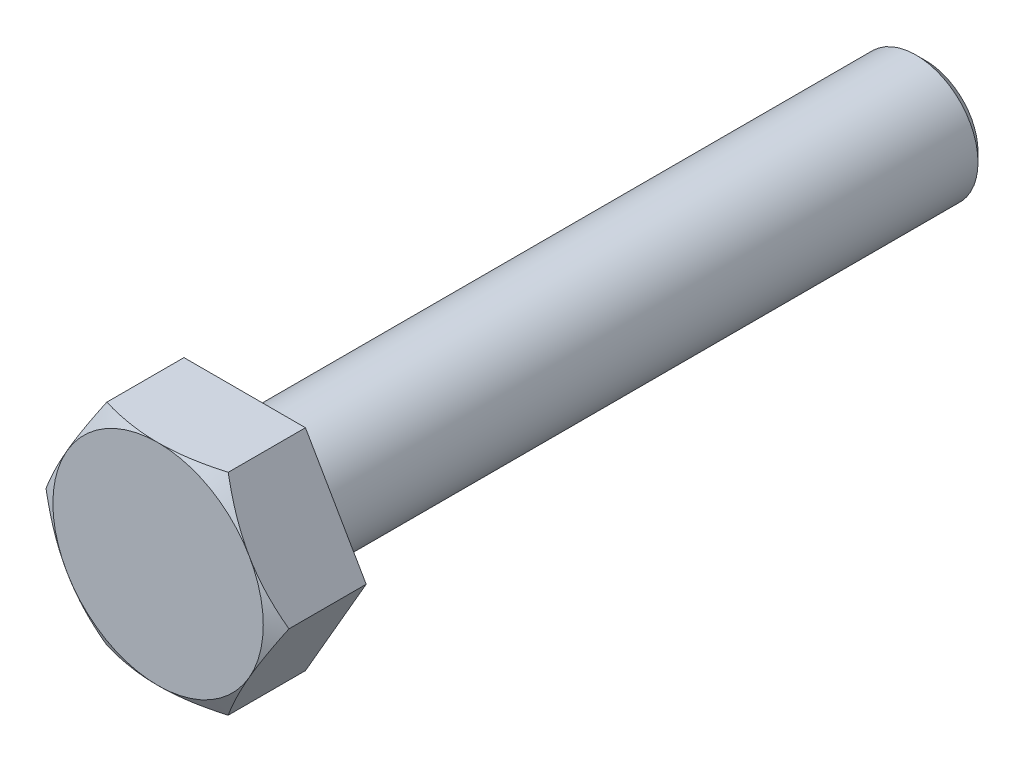
ISO-10303-21;
HEADER;
FILE_DESCRIPTION(('STEP AP214'),'2;1');
FILE_NAME('part.step','',(''),(''),'','','');
FILE_SCHEMA(('AUTOMOTIVE_DESIGN { 1 0 10303 214 1 1 1 1 }'));
ENDSEC;
DATA;
#1=APPLICATION_CONTEXT('core data for automotive mechanical design processes');
#2=APPLICATION_PROTOCOL_DEFINITION('international standard','automotive_design',2000,#1);
#3=PRODUCT_CONTEXT('',#1,'mechanical');
#4=PRODUCT('Part','Part','',(#3));
#5=PRODUCT_RELATED_PRODUCT_CATEGORY('part','',(#4));
#6=PRODUCT_DEFINITION_FORMATION('','',#4);
#7=PRODUCT_DEFINITION_CONTEXT('part definition',#1,'design');
#8=PRODUCT_DEFINITION('design','',#6,#7);
#9=PRODUCT_DEFINITION_SHAPE('','',#8);
#10=(LENGTH_UNIT() NAMED_UNIT(*) SI_UNIT(.MILLI.,.METRE.));
#11=(NAMED_UNIT(*) PLANE_ANGLE_UNIT() SI_UNIT($,.RADIAN.));
#12=(NAMED_UNIT(*) SI_UNIT($,.STERADIAN.) SOLID_ANGLE_UNIT());
#13=UNCERTAINTY_MEASURE_WITH_UNIT(LENGTH_MEASURE(1.E-05),#10,'distance_accuracy_value','');
#14=(GEOMETRIC_REPRESENTATION_CONTEXT(3) GLOBAL_UNCERTAINTY_ASSIGNED_CONTEXT((#13)) GLOBAL_UNIT_ASSIGNED_CONTEXT((#10,
#11,#12)) REPRESENTATION_CONTEXT('',''));
#15=CARTESIAN_POINT('',(0.,0.,0.));
#16=DIRECTION('',(0.,0.,1.));
#17=DIRECTION('',(1.,0.,0.));
#18=AXIS2_PLACEMENT_3D('',#15,#16,#17);
#19=CARTESIAN_POINT('',(9.81495457622364,0.,0.));
#20=DIRECTION('',(0.,0.,1.));
#21=DIRECTION('',(1.,0.,0.));
#22=AXIS2_PLACEMENT_3D('',#19,#20,#21);
#23=PLANE('',#22);
#24=DIRECTION('',(0.5,0.866025403784439,0.));
#25=VECTOR('',#24,1.);
#26=CARTESIAN_POINT('',(4.90747728811182,-8.50000000000001,0.));
#27=LINE('',#26,#25);
#28=CARTESIAN_POINT('',(4.90747728811182,-8.50000000000001,0.));
#29=VERTEX_POINT('',#28);
#30=CARTESIAN_POINT('',(9.81495457622364,0.,0.));
#31=VERTEX_POINT('',#30);
#32=EDGE_CURVE('E200',#29,#31,#27,.T.);
#33=ORIENTED_EDGE('',*,*,#32,.F.);
#34=DIRECTION('',(1.,0.,0.));
#35=VECTOR('',#34,1.);
#36=CARTESIAN_POINT('',(-4.9074772881118,-8.50000000000001,0.));
#37=LINE('',#36,#35);
#38=CARTESIAN_POINT('',(-4.9074772881118,-8.50000000000001,0.));
#39=VERTEX_POINT('',#38);
#40=EDGE_CURVE('E214',#39,#29,#37,.T.);
#41=ORIENTED_EDGE('',*,*,#40,.F.);
#42=DIRECTION('',(0.5,-0.866025403784438,0.));
#43=VECTOR('',#42,1.);
#44=CARTESIAN_POINT('',(-9.81495457622363,0.,0.));
#45=LINE('',#44,#43);
#46=CARTESIAN_POINT('',(-9.81495457622363,0.,0.));
#47=VERTEX_POINT('',#46);
#48=EDGE_CURVE('E211',#47,#39,#45,.T.);
#49=ORIENTED_EDGE('',*,*,#48,.F.);
#50=DIRECTION('',(-0.499999999999999,-0.866025403784439,0.));
#51=VECTOR('',#50,1.);
#52=CARTESIAN_POINT('',(-4.90747728811181,8.5,0.));
#53=LINE('',#52,#51);
#54=CARTESIAN_POINT('',(-4.90747728811181,8.5,0.));
#55=VERTEX_POINT('',#54);
#56=EDGE_CURVE('E208',#55,#47,#53,.T.);
#57=ORIENTED_EDGE('',*,*,#56,.F.);
#58=DIRECTION('',(-1.,0.,0.));
#59=VECTOR('',#58,1.);
#60=CARTESIAN_POINT('',(4.90747728811182,8.5,0.));
#61=LINE('',#60,#59);
#62=CARTESIAN_POINT('',(4.90747728811182,8.5,0.));
#63=VERTEX_POINT('',#62);
#64=EDGE_CURVE('E206',#63,#55,#61,.T.);
#65=ORIENTED_EDGE('',*,*,#64,.F.);
#66=DIRECTION('',(-0.5,0.866025403784439,0.));
#67=VECTOR('',#66,1.);
#68=CARTESIAN_POINT('',(9.81495457622364,0.,0.));
#69=LINE('',#68,#67);
#70=EDGE_CURVE('E203',#31,#63,#69,.T.);
#71=ORIENTED_EDGE('',*,*,#70,.F.);
#72=EDGE_LOOP('',(#33,#41,#49,#57,#65,#71));
#73=FACE_BOUND('',#72,.T.);
#74=CARTESIAN_POINT('',(0.,0.,0.));
#75=DIRECTION('',(0.,0.,1.));
#76=DIRECTION('',(1.,0.,0.));
#77=AXIS2_PLACEMENT_3D('',#74,#75,#76);
#78=CIRCLE('',#77,5.);
#79=CARTESIAN_POINT('',(5.,0.,0.));
#80=VERTEX_POINT('',#79);
#81=EDGE_CURVE('E141',#80,#80,#78,.F.);
#82=ORIENTED_EDGE('',*,*,#81,.F.);
#83=EDGE_LOOP('',(#82));
#84=FACE_BOUND('',#83,.T.);
#85=ADVANCED_FACE('F52',(#73,#84),#23,.F.);
#86=CARTESIAN_POINT('',(4.90747728811182,-8.50000000000001,7.));
#87=DIRECTION('',(-0.866025403784439,0.5,0.));
#88=DIRECTION('',(-0.5,-0.866025403784439,0.));
#89=AXIS2_PLACEMENT_3D('',#86,#87,#88);
#90=PLANE('',#89);
#91=CARTESIAN_POINT('',(4.90736181805798,-8.50020000000001,6.24074395360204));
#92=CARTESIAN_POINT('',(5.01523349642112,-8.31336077237732,6.30301386075109));
#93=CARTESIAN_POINT('',(5.1235073585344,-8.12582494206541,6.36245770425267));
#94=CARTESIAN_POINT('',(5.34093440801325,-7.74923024542824,6.47491488923975));
#95=CARTESIAN_POINT('',(5.45008795342048,-7.56017075895664,6.52792545501692));
#96=CARTESIAN_POINT('',(5.77929626245293,-6.98996524143861,6.67626661026955));
#97=CARTESIAN_POINT('',(6.00065055601907,-6.60656835850854,6.76064107206222));
#98=CARTESIAN_POINT('',(6.33190297706554,-6.03282233512585,6.85957998430525));
#99=CARTESIAN_POINT('',(6.44081150248911,-5.84418723571482,6.88776480055181));
#100=CARTESIAN_POINT('',(6.65912106673028,-5.4660639786709,6.93502591523381));
#101=CARTESIAN_POINT('',(6.76852206116958,-5.27657589790346,6.95410301844705));
#102=CARTESIAN_POINT('',(6.98751241863724,-4.8972734724018,6.9826652273342));
#103=CARTESIAN_POINT('',(7.09710142587342,-4.70745974391771,6.99216121852868));
#104=CARTESIAN_POINT('',(7.31638067381389,-4.32765694543932,7.00135762036095));
#105=CARTESIAN_POINT('',(7.42607091128588,-4.13766788104354,7.00105833363274));
#106=CARTESIAN_POINT('',(7.63114046852538,-3.78247698881906,6.9913455244265));
#107=CARTESIAN_POINT('',(7.72653426027262,-3.61725009478621,6.98311683140245));
#108=CARTESIAN_POINT('',(7.91709842091259,-3.28718328645605,6.9594107589431));
#109=CARTESIAN_POINT('',(8.01226877430994,-3.12234339899756,6.94393289088121));
#110=CARTESIAN_POINT('',(8.29741139110886,-2.62846189929869,6.88699137914137));
#111=CARTESIAN_POINT('',(8.48687892877741,-2.30029449767179,6.8350269387224));
#112=CARTESIAN_POINT('',(8.86782383081656,-1.64047857245564,6.70511505947707));
#113=CARTESIAN_POINT('',(9.05925257719133,-1.30891425770532,6.62661693012797));
#114=CARTESIAN_POINT('',(9.43925537404324,-0.650730106539531,6.44845866002739));
#115=CARTESIAN_POINT('',(9.62783429074897,-0.324101841568914,6.34884036387004));
#116=CARTESIAN_POINT('',(9.81507004627747,0.000200000000009231,6.24074395360205));
#117=B_SPLINE_CURVE_WITH_KNOTS('',3,(#91,#92,#93,#94,#95,#96,#97,#98,#99,#100,#101,#102,#103,
#104,#105,#106,#107,#108,#109,#110,#111,#112,#113,#114,#115,#116),.UNSPECIFIED.,.F.,.F.,(4,2,2,
2,2,2,2,2,2,2,2,2,4),(0.,0.673596396411508,1.34748239783842,2.69805431639326,3.356799954547,
4.01548737369113,4.67342558367775,5.33134346608655,5.9040955679884,6.47688628148364,
7.62328361419565,8.79510569878587,9.96462743748731),.UNSPECIFIED.);
#118=CARTESIAN_POINT('',(4.90747728811182,-8.50000000000001,6.24081062144516));
#119=VERTEX_POINT('',#118);
#120=CARTESIAN_POINT('',(7.36121593216774,-4.24999999999999,7.));
#121=VERTEX_POINT('',#120);
#122=EDGE_CURVE('E198',#119,#121,#117,.T.);
#123=ORIENTED_EDGE('',*,*,#122,.F.);
#124=DIRECTION('',(0.,0.,-1.));
#125=VECTOR('',#124,1.);
#126=CARTESIAN_POINT('',(4.90747728811182,-8.50000000000001,7.));
#127=LINE('',#126,#125);
#128=EDGE_CURVE('E217',#119,#29,#127,.T.);
#129=ORIENTED_EDGE('',*,*,#128,.T.);
#130=ORIENTED_EDGE('',*,*,#32,.T.);
#131=DIRECTION('',(0.,0.,-1.));
#132=VECTOR('',#131,1.);
#133=CARTESIAN_POINT('',(9.81495457622364,0.,7.));
#134=LINE('',#133,#132);
#135=CARTESIAN_POINT('',(9.81495457622364,0.,6.24081062144517));
#136=VERTEX_POINT('',#135);
#137=EDGE_CURVE('E226',#136,#31,#134,.T.);
#138=ORIENTED_EDGE('',*,*,#137,.F.);
#139=EDGE_CURVE('E192',#121,#136,#117,.T.);
#140=ORIENTED_EDGE('',*,*,#139,.F.);
#141=EDGE_LOOP('',(#123,#129,#130,#138,#140));
#142=FACE_BOUND('',#141,.T.);
#143=ADVANCED_FACE('F187',(#142),#90,.F.);
#144=CARTESIAN_POINT('',(9.81495457622364,0.,7.));
#145=DIRECTION('',(-0.866025403784438,-0.5,0.));
#146=DIRECTION('',(0.5,-0.866025403784439,0.));
#147=AXIS2_PLACEMENT_3D('',#144,#145,#146);
#148=PLANE('',#147);
#149=CARTESIAN_POINT('',(9.81507004627747,-0.000199999999991347,6.24074395360205));
#150=CARTESIAN_POINT('',(9.70719836791433,0.1866392276227,6.30301386075109));
#151=CARTESIAN_POINT('',(9.59892450580105,0.374175057934605,6.36245770425268));
#152=CARTESIAN_POINT('',(9.3814974563222,0.75076975457177,6.47491488923976));
#153=CARTESIAN_POINT('',(9.27234391091497,0.939829241043374,6.52792545501693));
#154=CARTESIAN_POINT('',(8.94313560188252,1.5100347585614,6.67626661026956));
#155=CARTESIAN_POINT('',(8.72178130831639,1.89343164149147,6.76064107206223));
#156=CARTESIAN_POINT('',(8.39052888726991,2.46717766487417,6.85957998430526));
#157=CARTESIAN_POINT('',(8.28162036184634,2.65581276428519,6.88776480055181));
#158=CARTESIAN_POINT('',(8.06331079760518,3.03393602132912,6.93502591523381));
#159=CARTESIAN_POINT('',(7.95390980316587,3.22342410209655,6.95410301844705));
#160=CARTESIAN_POINT('',(7.73491944569821,3.60272652759821,6.98266522733421));
#161=CARTESIAN_POINT('',(7.62533043846204,3.7925402560823,6.99216121852868));
#162=CARTESIAN_POINT('',(7.40605119052156,4.17234305456069,7.00135762036096));
#163=CARTESIAN_POINT('',(7.29636095304957,4.36233211895647,7.00105833363275));
#164=CARTESIAN_POINT('',(7.09129139581007,4.71752301118095,6.9913455244265));
#165=CARTESIAN_POINT('',(6.99589760406283,4.8827499052138,6.98311683140245));
#166=CARTESIAN_POINT('',(6.80533344342286,5.21281671354395,6.9594107589431));
#167=CARTESIAN_POINT('',(6.71016309002551,5.37765660100244,6.94393289088121));
#168=CARTESIAN_POINT('',(6.42502047322659,5.87153810070131,6.88699137914137));
#169=CARTESIAN_POINT('',(6.23555293555804,6.19970550232821,6.8350269387224));
#170=CARTESIAN_POINT('',(5.8546080335189,6.85952142754436,6.70511505947707));
#171=CARTESIAN_POINT('',(5.66317928714412,7.19108574229468,6.62661693012798));
#172=CARTESIAN_POINT('',(5.28317649029221,7.84926989346047,6.44845866002739));
#173=CARTESIAN_POINT('',(5.09459757358649,8.17589815843108,6.34884036387004));
#174=CARTESIAN_POINT('',(4.90736181805798,8.5002,6.24074395360205));
#175=B_SPLINE_CURVE_WITH_KNOTS('',3,(#149,#150,#151,#152,#153,#154,#155,#156,#157,#158,#159,
#160,#161,#162,#163,#164,#165,#166,#167,#168,#169,#170,#171,#172,#173,#174),.UNSPECIFIED.,.F.,
.F.,(4,2,2,2,2,2,2,2,2,2,2,2,4),(0.,0.673596396411507,1.34748239783841,2.69805431639326,
3.35679995454699,4.01548737369113,4.67342558367775,5.33134346608655,5.90409556798839,
6.47688628148363,7.62328361419564,8.79510569878585,9.96462743748729),.UNSPECIFIED.);
#176=CARTESIAN_POINT('',(7.36121593216774,4.25000000000002,7.));
#177=VERTEX_POINT('',#176);
#178=EDGE_CURVE('E199',#136,#177,#175,.T.);
#179=ORIENTED_EDGE('',*,*,#178,.F.);
#180=ORIENTED_EDGE('',*,*,#137,.T.);
#181=ORIENTED_EDGE('',*,*,#70,.T.);
#182=DIRECTION('',(0.,0.,-1.));
#183=VECTOR('',#182,1.);
#184=CARTESIAN_POINT('',(4.90747728811182,8.5,7.));
#185=LINE('',#184,#183);
#186=CARTESIAN_POINT('',(4.90747728811182,8.5,6.24081062144517));
#187=VERTEX_POINT('',#186);
#188=EDGE_CURVE('E224',#187,#63,#185,.T.);
#189=ORIENTED_EDGE('',*,*,#188,.F.);
#190=EDGE_CURVE('E127',#177,#187,#175,.T.);
#191=ORIENTED_EDGE('',*,*,#190,.F.);
#192=EDGE_LOOP('',(#179,#180,#181,#189,#191));
#193=FACE_BOUND('',#192,.T.);
#194=ADVANCED_FACE('F182',(#193),#148,.F.);
#195=CARTESIAN_POINT('',(4.90747728811182,8.5,7.));
#196=DIRECTION('',(0.,-1.,0.));
#197=DIRECTION('',(1.,0.,0.));
#198=AXIS2_PLACEMENT_3D('',#195,#196,#197);
#199=PLANE('',#198);
#200=CARTESIAN_POINT('',(-13.3127722555906,8.5,2.78826852986932));
#201=CARTESIAN_POINT('',(-12.9404144406593,8.5,2.96941701431854));
#202=CARTESIAN_POINT('',(-12.567215792402,8.5,3.14886602911127));
#203=CARTESIAN_POINT('',(-11.8186901702636,8.5,3.50341189717156));
#204=CARTESIAN_POINT('',(-11.4433628836555,8.5,3.6785080894789));
#205=CARTESIAN_POINT('',(-10.6882613644858,8.5,4.02424829360525));
#206=CARTESIAN_POINT('',(-10.3084741208881,8.5,4.19486398516614));
#207=CARTESIAN_POINT('',(-9.54592452037174,8.5,4.52928604651138));
#208=CARTESIAN_POINT('',(-9.16316230121106,8.5,4.6930927293873));
#209=CARTESIAN_POINT('',(-8.38118642163861,8.5,5.01744068546287));
#210=CARTESIAN_POINT('',(-7.98185075741088,8.5,5.17768941082055));
#211=CARTESIAN_POINT('',(-7.1785568746563,8.5,5.4863721721723));
#212=CARTESIAN_POINT('',(-6.77459815015405,8.5,5.63480490053196));
#213=CARTESIAN_POINT('',(-5.96212545771606,8.5,5.91605400578927));
#214=CARTESIAN_POINT('',(-5.55362216781185,8.5,6.04890090403381));
#215=CARTESIAN_POINT('',(-4.73077113127289,8.5,6.29480344231656));
#216=CARTESIAN_POINT('',(-4.31642522789706,8.5,6.40786517973007));
#217=CARTESIAN_POINT('',(-3.48392241105069,8.5,6.60824046844821));
#218=CARTESIAN_POINT('',(-3.06580135614189,8.5,6.69569903377702));
#219=CARTESIAN_POINT('',(-2.43470958332224,8.5,6.80396887865594));
#220=CARTESIAN_POINT('',(-2.22367936823634,8.5,6.836240585499));
#221=CARTESIAN_POINT('',(-1.80052615623366,8.5,6.89251500239286));
#222=CARTESIAN_POINT('',(-1.58840326733942,8.5,6.91651851450317));
#223=CARTESIAN_POINT('',(-1.16617674125606,8.5,6.95547032072195));
#224=CARTESIAN_POINT('',(-0.956083894124211,8.5,6.97053508997365));
#225=CARTESIAN_POINT('',(-0.535448956339841,8.5,6.99176045016895));
#226=CARTESIAN_POINT('',(-0.324906873388335,8.5,6.99792119254076));
#227=CARTESIAN_POINT('',(0.0962490157034425,8.5,7.00119101168361));
#228=CARTESIAN_POINT('',(0.306862821747327,8.5,6.99830010057134));
#229=CARTESIAN_POINT('',(0.727778025528256,8.5,6.98353896935653));
#230=CARTESIAN_POINT('',(0.938079408017831,8.5,6.97166832455666));
#231=CARTESIAN_POINT('',(1.43959695159484,8.5,6.93290684508362));
#232=CARTESIAN_POINT('',(1.73050755044522,8.5,6.90197235135525));
#233=CARTESIAN_POINT('',(2.31024091921276,8.5,6.82457884662193));
#234=CARTESIAN_POINT('',(2.59906341485208,8.5,6.77811783270236));
#235=CARTESIAN_POINT('',(3.46202954887685,8.5,6.61790252618368));
#236=CARTESIAN_POINT('',(4.03236565990882,8.5,6.4833428350329));
#237=CARTESIAN_POINT('',(4.8853268846872,8.5,6.24909447510685));
#238=CARTESIAN_POINT('',(5.1723521357312,8.5,6.16449811272701));
#239=CARTESIAN_POINT('',(5.74361736454075,8.5,5.98628925318513));
#240=CARTESIAN_POINT('',(6.02785732321869,8.5,5.89267669428261));
#241=CARTESIAN_POINT('',(6.59363668173595,8.5,5.69795634941171));
#242=CARTESIAN_POINT('',(6.87517688252757,8.5,5.5968508693248));
#243=CARTESIAN_POINT('',(7.43590957248353,8.5,5.38835708016051));
#244=CARTESIAN_POINT('',(7.71510209449517,8.5,5.28096885915528));
#245=CARTESIAN_POINT('',(8.3937769231789,8.5,5.01254661879005));
#246=CARTESIAN_POINT('',(8.79214345747848,8.5,4.84869607279849));
#247=CARTESIAN_POINT('',(9.58530180729763,8.5,4.51253355712982));
#248=CARTESIAN_POINT('',(9.98009336208866,8.5,4.34022097609763));
#249=CARTESIAN_POINT('',(10.7667994687314,8.5,3.98889531541797));
#250=CARTESIAN_POINT('',(11.158713237833,8.5,3.80988048804884));
#251=CARTESIAN_POINT('',(11.9400608781415,8.5,3.44655799464724));
#252=CARTESIAN_POINT('',(12.3294948120185,8.5,3.26225046302525));
#253=CARTESIAN_POINT('',(13.1067885410169,8.5,2.88913981832012));
#254=CARTESIAN_POINT('',(13.4946458119203,8.5,2.70033145634226));
#255=CARTESIAN_POINT('',(14.2686448555246,8.5,2.31923087705477));
#256=CARTESIAN_POINT('',(14.6547866194464,8.5,2.12693864194171));
#257=CARTESIAN_POINT('',(15.4255695165389,8.5,1.73951703281517));
#258=CARTESIAN_POINT('',(15.8102108677963,8.5,1.54438809221331));
#259=CARTESIAN_POINT('',(16.5782744335987,8.5,1.15174407271826));
#260=CARTESIAN_POINT('',(16.961696643168,8.5,0.9542289841026));
#261=CARTESIAN_POINT('',(18.0423270244777,8.5,0.393993394329548));
#262=CARTESIAN_POINT('',(18.7383366520514,8.5,0.0289612323611447));
#263=CARTESIAN_POINT('',(20.1277877153105,8.5,-0.706016396451721));
#264=CARTESIAN_POINT('',(20.8212290431881,8.50000000000001,-1.07596206662414));
#265=CARTESIAN_POINT('',(22.2042055328319,8.50000000000001,-1.8185574653129));
#266=CARTESIAN_POINT('',(22.8937461922833,8.50000000000001,-2.19119696613751));
#267=CARTESIAN_POINT('',(24.2711951731736,8.50000000000001,-2.93938175625438));
#268=CARTESIAN_POINT('',(24.9591035921503,8.50000000000001,-3.31492686589471));
#269=CARTESIAN_POINT('',(25.6464179156733,8.50000000000001,-3.69154780861944));
#270=B_SPLINE_CURVE_WITH_KNOTS('',3,(#200,#201,#202,#203,#204,#205,#206,#207,#208,#209,#210,
#211,#212,#213,#214,#215,#216,#217,#218,#219,#220,#221,#222,#223,#224,#225,#226,#227,#228,#229,
#230,#231,#232,#233,#234,#235,#236,#237,#238,#239,#240,#241,#242,#243,#244,#245,#246,#247,#248,
#249,#250,#251,#252,#253,#254,#255,#256,#257,#258,#259,#260,#261,#262,#263,#264,#265,#266,#267,
#268,#269),.UNSPECIFIED.,.F.,.F.,(4,2,2,2,2,2,2,2,2,2,2,2,2,2,2,2,2,2,2,2,2,2,2,2,2,2,2,2,2,2,2,
2,2,2,4),(0.,1.24226493543645,2.48471736610549,3.73371640399653,4.98265794678726,
6.27337976098354,7.56424421677546,8.85253705017218,10.1404321566129,11.4208849829597,
12.0611991424598,12.7014511705268,13.3331660336055,13.9648701531666,14.59657342712,
15.2283065794053,16.1054657093355,16.9827380361343,18.7382005792614,19.6358195315064,
20.5334446308395,21.4307946318258,22.328132056673,23.6202378689622,24.912437169511,
26.2049758119965,27.4974816588931,28.7915767023275,30.0856783607683,31.3795843330998,
32.6734955792911,35.0312403285486,37.3890829505185,39.7404445819589,42.091661973883),.UNSPECIFIED.);
#271=CARTESIAN_POINT('',(0.,8.50000000000002,7.));
#272=VERTEX_POINT('',#271);
#273=EDGE_CURVE('E123',#187,#272,#270,.F.);
#274=ORIENTED_EDGE('',*,*,#273,.F.);
#275=ORIENTED_EDGE('',*,*,#188,.T.);
#276=ORIENTED_EDGE('',*,*,#64,.T.);
#277=DIRECTION('',(0.,0.,-1.));
#278=VECTOR('',#277,1.);
#279=CARTESIAN_POINT('',(-4.90747728811181,8.5,7.));
#280=LINE('',#279,#278);
#281=CARTESIAN_POINT('',(-4.90747728811181,8.5,6.24081062144518));
#282=VERTEX_POINT('',#281);
#283=EDGE_CURVE('E153',#282,#55,#280,.T.);
#284=ORIENTED_EDGE('',*,*,#283,.F.);
#285=EDGE_CURVE('E131',#272,#282,#270,.F.);
#286=ORIENTED_EDGE('',*,*,#285,.F.);
#287=EDGE_LOOP('',(#274,#275,#276,#284,#286));
#288=FACE_BOUND('',#287,.T.);
#289=ADVANCED_FACE('F151',(#288),#199,.F.);
#290=CARTESIAN_POINT('',(-4.90747728811181,8.5,7.));
#291=DIRECTION('',(0.866025403784439,-0.499999999999999,0.));
#292=DIRECTION('',(0.499999999999999,0.866025403784439,0.));
#293=AXIS2_PLACEMENT_3D('',#290,#291,#292);
#294=PLANE('',#293);
#295=CARTESIAN_POINT('',(-4.90736181805798,8.5002,6.24074395360205));
#296=CARTESIAN_POINT('',(-5.01523349642112,8.31336077237731,6.3030138607511));
#297=CARTESIAN_POINT('',(-5.1235073585344,8.1258249420654,6.36245770425268));
#298=CARTESIAN_POINT('',(-5.34093440801325,7.74923024542824,6.47491488923977));
#299=CARTESIAN_POINT('',(-5.45008795342048,7.56017075895664,6.52792545501693));
#300=CARTESIAN_POINT('',(-5.77929626245292,6.98996524143861,6.67626661026956));
#301=CARTESIAN_POINT('',(-6.00065055601906,6.60656835850854,6.76064107206223));
#302=CARTESIAN_POINT('',(-6.33190297706554,6.03282233512585,6.85957998430526));
#303=CARTESIAN_POINT('',(-6.4408115024891,5.84418723571482,6.88776480055182));
#304=CARTESIAN_POINT('',(-6.65912106673027,5.4660639786709,6.93502591523382));
#305=CARTESIAN_POINT('',(-6.76852206116957,5.27657589790347,6.95410301844706));
#306=CARTESIAN_POINT('',(-6.98751241863723,4.89727347240181,6.98266522733421));
#307=CARTESIAN_POINT('',(-7.09710142587341,4.70745974391771,6.99216121852868));
#308=CARTESIAN_POINT('',(-7.31638067381388,4.32765694543932,7.00135762036096));
#309=CARTESIAN_POINT('',(-7.42607091128587,4.13766788104354,7.00105833363275));
#310=CARTESIAN_POINT('',(-7.63114046852538,3.78247698881906,6.99134552442651));
#311=CARTESIAN_POINT('',(-7.72653426027261,3.61725009478621,6.98311683140246));
#312=CARTESIAN_POINT('',(-7.91709842091259,3.28718328645605,6.95941075894311));
#313=CARTESIAN_POINT('',(-8.01226877430993,3.12234339899756,6.94393289088121));
#314=CARTESIAN_POINT('',(-8.29741139110885,2.62846189929869,6.88699137914137));
#315=CARTESIAN_POINT('',(-8.4868789287774,2.30029449767179,6.83502693872241));
#316=CARTESIAN_POINT('',(-8.86782383081655,1.64047857245564,6.70511505947707));
#317=CARTESIAN_POINT('',(-9.05925257719132,1.30891425770532,6.62661693012798));
#318=CARTESIAN_POINT('',(-9.43925537404323,0.650730106539532,6.44845866002739));
#319=CARTESIAN_POINT('',(-9.62783429074896,0.324101841568915,6.34884036387005));
#320=CARTESIAN_POINT('',(-9.81507004627747,-0.000200000000006813,6.24074395360205));
#321=B_SPLINE_CURVE_WITH_KNOTS('',3,(#295,#296,#297,#298,#299,#300,#301,#302,#303,#304,#305,
#306,#307,#308,#309,#310,#311,#312,#313,#314,#315,#316,#317,#318,#319,#320),.UNSPECIFIED.,.F.,
.F.,(4,2,2,2,2,2,2,2,2,2,2,2,4),(0.,0.673596396411506,1.34748239783841,2.69805431639325,
3.35679995454699,4.01548737369112,4.67342558367775,5.33134346608654,5.90409556798839,
6.47688628148363,7.62328361419564,8.79510569878586,9.9646274374873),.UNSPECIFIED.);
#322=CARTESIAN_POINT('',(-7.36121593216774,4.25000000000001,7.));
#323=VERTEX_POINT('',#322);
#324=EDGE_CURVE('E138',#282,#323,#321,.T.);
#325=ORIENTED_EDGE('',*,*,#324,.F.);
#326=ORIENTED_EDGE('',*,*,#283,.T.);
#327=ORIENTED_EDGE('',*,*,#56,.T.);
#328=DIRECTION('',(0.,0.,-1.));
#329=VECTOR('',#328,1.);
#330=CARTESIAN_POINT('',(-9.81495457622363,0.,7.));
#331=LINE('',#330,#329);
#332=CARTESIAN_POINT('',(-9.81495457622363,0.,6.24081062144517));
#333=VERTEX_POINT('',#332);
#334=EDGE_CURVE('E221',#333,#47,#331,.T.);
#335=ORIENTED_EDGE('',*,*,#334,.F.);
#336=EDGE_CURVE('E154',#323,#333,#321,.T.);
#337=ORIENTED_EDGE('',*,*,#336,.F.);
#338=EDGE_LOOP('',(#325,#326,#327,#335,#337));
#339=FACE_BOUND('',#338,.T.);
#340=ADVANCED_FACE('F181',(#339),#294,.F.);
#341=CARTESIAN_POINT('',(-9.81495457622363,0.,7.));
#342=DIRECTION('',(0.866025403784438,0.5,0.));
#343=DIRECTION('',(-0.5,0.866025403784438,0.));
#344=AXIS2_PLACEMENT_3D('',#341,#342,#343);
#345=PLANE('',#344);
#346=CARTESIAN_POINT('',(-9.81507004627747,0.000199999999992332,6.24074395360205));
#347=CARTESIAN_POINT('',(-9.70719836791432,-0.186639227622698,6.3030138607511));
#348=CARTESIAN_POINT('',(-9.59892450580105,-0.374175057934604,6.36245770425268));
#349=CARTESIAN_POINT('',(-9.38149745632219,-0.750769754571769,6.47491488923977));
#350=CARTESIAN_POINT('',(-9.27234391091496,-0.939829241043373,6.52792545501693));
#351=CARTESIAN_POINT('',(-8.94313560188252,-1.5100347585614,6.67626661026956));
#352=CARTESIAN_POINT('',(-8.72178130831638,-1.89343164149147,6.76064107206223));
#353=CARTESIAN_POINT('',(-8.3905288872699,-2.46717766487416,6.85957998430526));
#354=CARTESIAN_POINT('',(-8.28162036184634,-2.65581276428519,6.88776480055182));
#355=CARTESIAN_POINT('',(-8.06331079760517,-3.03393602132911,6.93502591523381));
#356=CARTESIAN_POINT('',(-7.95390980316586,-3.22342410209654,6.95410301844705));
#357=CARTESIAN_POINT('',(-7.7349194456982,-3.6027265275982,6.98266522733421));
#358=CARTESIAN_POINT('',(-7.62533043846203,-3.79254025608229,6.99216121852868));
#359=CARTESIAN_POINT('',(-7.40605119052156,-4.17234305456068,7.00135762036096));
#360=CARTESIAN_POINT('',(-7.29636095304956,-4.36233211895647,7.00105833363275));
#361=CARTESIAN_POINT('',(-7.09129139581006,-4.71752301118094,6.9913455244265));
#362=CARTESIAN_POINT('',(-6.99589760406282,-4.8827499052138,6.98311683140245));
#363=CARTESIAN_POINT('',(-6.80533344342285,-5.21281671354395,6.9594107589431));
#364=CARTESIAN_POINT('',(-6.7101630900255,-5.37765660100244,6.94393289088121));
#365=CARTESIAN_POINT('',(-6.42502047322658,-5.87153810070131,6.88699137914137));
#366=CARTESIAN_POINT('',(-6.23555293555803,-6.19970550232821,6.8350269387224));
#367=CARTESIAN_POINT('',(-5.85460803351889,-6.85952142754436,6.70511505947707));
#368=CARTESIAN_POINT('',(-5.66317928714411,-7.19108574229468,6.62661693012797));
#369=CARTESIAN_POINT('',(-5.2831764902922,-7.84926989346047,6.44845866002738));
#370=CARTESIAN_POINT('',(-5.09459757358647,-8.17589815843109,6.34884036387004));
#371=CARTESIAN_POINT('',(-4.90736181805796,-8.50020000000001,6.24074395360204));
#372=B_SPLINE_CURVE_WITH_KNOTS('',3,(#346,#347,#348,#349,#350,#351,#352,#353,#354,#355,#356,
#357,#358,#359,#360,#361,#362,#363,#364,#365,#366,#367,#368,#369,#370,#371),.UNSPECIFIED.,.F.,
.F.,(4,2,2,2,2,2,2,2,2,2,2,2,4),(0.,0.673596396411507,1.34748239783841,2.69805431639325,
3.35679995454699,4.01548737369112,4.67342558367775,5.33134346608654,5.90409556798838,
6.47688628148363,7.62328361419564,8.79510569878586,9.9646274374873),.UNSPECIFIED.);
#373=CARTESIAN_POINT('',(-7.36121593216774,-4.25,7.));
#374=VERTEX_POINT('',#373);
#375=EDGE_CURVE('E271',#333,#374,#372,.T.);
#376=ORIENTED_EDGE('',*,*,#375,.F.);
#377=ORIENTED_EDGE('',*,*,#334,.T.);
#378=ORIENTED_EDGE('',*,*,#48,.T.);
#379=DIRECTION('',(0.,0.,-1.));
#380=VECTOR('',#379,1.);
#381=CARTESIAN_POINT('',(-4.9074772881118,-8.50000000000001,7.));
#382=LINE('',#381,#380);
#383=CARTESIAN_POINT('',(-4.9074772881118,-8.50000000000001,6.24081062144516));
#384=VERTEX_POINT('',#383);
#385=EDGE_CURVE('E219',#384,#39,#382,.T.);
#386=ORIENTED_EDGE('',*,*,#385,.F.);
#387=EDGE_CURVE('E266',#374,#384,#372,.T.);
#388=ORIENTED_EDGE('',*,*,#387,.F.);
#389=EDGE_LOOP('',(#376,#377,#378,#386,#388));
#390=FACE_BOUND('',#389,.T.);
#391=ADVANCED_FACE('F257',(#390),#345,.F.);
#392=CARTESIAN_POINT('',(-4.9074772881118,-8.50000000000001,7.));
#393=DIRECTION('',(0.,1.,0.));
#394=DIRECTION('',(-1.,0.,0.));
#395=AXIS2_PLACEMENT_3D('',#392,#393,#394);
#396=PLANE('',#395);
#397=CARTESIAN_POINT('',(-13.3127722588559,-8.50000000000001,2.78826852828037));
#398=CARTESIAN_POINT('',(-12.9404144438147,-8.50000000000001,2.96941701279586));
#399=CARTESIAN_POINT('',(-12.5672157954476,-8.50000000000001,3.14886602765483));
#400=CARTESIAN_POINT('',(-11.8186901730891,-8.50000000000001,3.50341189584728));
#401=CARTESIAN_POINT('',(-11.4433628863708,-8.50000000000001,3.67850808822054));
#402=CARTESIAN_POINT('',(-10.6882613669791,-8.50000000000001,4.02424829247877));
#403=CARTESIAN_POINT('',(-10.3084741232694,-8.50000000000001,4.19486398410563));
#404=CARTESIAN_POINT('',(-9.54592452252851,-8.50000000000001,4.52928604558168));
#405=CARTESIAN_POINT('',(-9.16316230325517,-8.50000000000001,4.69309272852246));
#406=CARTESIAN_POINT('',(-8.38118642344855,-8.50000000000001,5.01744068472969));
#407=CARTESIAN_POINT('',(-7.98185075909923,-8.50000000000001,5.177689410154));
#408=CARTESIAN_POINT('',(-7.17855687609953,-8.50000000000001,5.48637217163547));
#409=CARTESIAN_POINT('',(-6.77459815147374,-8.50000000000001,5.6348049000582));
#410=CARTESIAN_POINT('',(-5.96212545878636,-8.50000000000001,5.91605400543564));
#411=CARTESIAN_POINT('',(-5.55362216875632,-8.50000000000001,6.04890090373724));
#412=CARTESIAN_POINT('',(-4.7307711319623,-8.50000000000001,6.29480344212482));
#413=CARTESIAN_POINT('',(-4.31642522845723,-8.50000000000001,6.4078651795861));
#414=CARTESIAN_POINT('',(-3.4839224112861,-8.50000000000001,6.60824046840058));
#415=CARTESIAN_POINT('',(-3.06580135618087,-8.50000000000001,6.69569903377429));
#416=CARTESIAN_POINT('',(-2.4347095830631,-8.50000000000001,6.8039688786984));
#417=CARTESIAN_POINT('',(-2.22367936787728,-8.50000000000001,6.83624058555283));
#418=CARTESIAN_POINT('',(-1.80052615567393,-8.50000000000001,6.89251500246121));
#419=CARTESIAN_POINT('',(-1.58840326667893,-8.50000000000001,6.91651851457466));
#420=CARTESIAN_POINT('',(-1.16617674039616,-8.50000000000001,6.95547032079083));
#421=CARTESIAN_POINT('',(-0.956083893165658,-8.50000000000001,6.97053509003693));
#422=CARTESIAN_POINT('',(-0.535448955184186,-8.50000000000001,6.99176045021233));
#423=CARTESIAN_POINT('',(-0.324906872134225,-8.50000000000001,6.99792119256982));
#424=CARTESIAN_POINT('',(0.0962490171537305,-8.50000000000001,7.00119101167553));
#425=CARTESIAN_POINT('',(0.306862823295337,-8.50000000000001,6.99830010054042));
#426=CARTESIAN_POINT('',(0.727778027270438,-8.50000000000001,6.98353896927202));
#427=CARTESIAN_POINT('',(0.938079409856463,-8.50000000000001,6.9716683244414));
#428=CARTESIAN_POINT('',(1.43959695358239,-8.50000000000001,6.93290684489274));
#429=CARTESIAN_POINT('',(1.73050755248482,-8.50000000000001,6.90197235112083));
#430=CARTESIAN_POINT('',(2.31024092135409,-8.50000000000001,6.82457884629812));
#431=CARTESIAN_POINT('',(2.5990634170431,-8.50000000000001,6.77811783233269));
#432=CARTESIAN_POINT('',(3.46202955121422,-8.5,6.61790252567546));
#433=CARTESIAN_POINT('',(4.03236566233993,-8.50000000000001,6.48334283443109));
#434=CARTESIAN_POINT('',(4.88532688725847,-8.50000000000001,6.24909447436698));
#435=CARTESIAN_POINT('',(5.17235213835015,-8.50000000000001,6.16449811194083));
#436=CARTESIAN_POINT('',(5.74361736725454,-8.50000000000001,5.98628925230773));
#437=CARTESIAN_POINT('',(6.02785732597963,-8.50000000000001,5.89267669336032));
#438=CARTESIAN_POINT('',(6.59363668459085,-8.50000000000001,5.69795634840122));
#439=CARTESIAN_POINT('',(6.87517688542928,-8.50000000000001,5.59685086827102));
#440=CARTESIAN_POINT('',(7.43590957547886,-8.50000000000001,5.38835707902163));
#441=CARTESIAN_POINT('',(7.71510209753731,-8.5,5.28096885797462));
#442=CARTESIAN_POINT('',(8.3937769262519,-8.5,5.01254661754213));
#443=CARTESIAN_POINT('',(8.79214346053648,-8.5,4.84869607152811));
#444=CARTESIAN_POINT('',(9.5853018103274,-8.5,4.51253355582005));
#445=CARTESIAN_POINT('',(9.98009336510521,-8.5,4.34022097477093));
#446=CARTESIAN_POINT('',(10.7667994717229,-8.5,3.98889531406161));
#447=CARTESIAN_POINT('',(11.1587132408126,-8.5,3.80988048667974));
#448=CARTESIAN_POINT('',(11.9400608810987,-8.5,3.44655799325578));
#449=CARTESIAN_POINT('',(12.3294948149651,-8.5,3.26225046162416));
#450=CARTESIAN_POINT('',(13.1067885439427,-8.5,2.88913981690239));
#451=CARTESIAN_POINT('',(13.4946458148359,-8.5,2.70033145491752));
#452=CARTESIAN_POINT('',(14.2686448584208,-8.5,2.31923087561787));
#453=CARTESIAN_POINT('',(14.6547866223333,-8.5,2.12693864049964));
#454=CARTESIAN_POINT('',(15.4255695194078,-8.5,1.73951703136417));
#455=CARTESIAN_POINT('',(15.8102108706567,-8.5,1.54438809075853));
#456=CARTESIAN_POINT('',(16.5782744364423,-8.5,1.15174407125707));
#457=CARTESIAN_POINT('',(16.9616966460036,-8.5,0.954228982638763));
#458=CARTESIAN_POINT('',(18.0423270273027,-8.5,0.39399339285356));
#459=CARTESIAN_POINT('',(18.7383366548741,-8.5,0.0289612308765693));
#460=CARTESIAN_POINT('',(20.1277877181298,-8.5,-0.706016397951598));
#461=CARTESIAN_POINT('',(20.8212290460062,-8.5,-1.07596206813073));
#462=CARTESIAN_POINT('',(22.2042055356501,-8.5,-1.81855746683274));
#463=CARTESIAN_POINT('',(22.893746195103,-8.5,-2.1911969676639));
#464=CARTESIAN_POINT('',(24.2711951759969,-8.5,-2.93938175779296));
#465=CARTESIAN_POINT('',(24.9591035949756,-8.5,-3.31492686743892));
#466=CARTESIAN_POINT('',(25.6464179185008,-8.5,-3.69154781016899));
#467=B_SPLINE_CURVE_WITH_KNOTS('',3,(#397,#398,#399,#400,#401,#402,#403,#404,#405,#406,#407,
#408,#409,#410,#411,#412,#413,#414,#415,#416,#417,#418,#419,#420,#421,#422,#423,#424,#425,#426,
#427,#428,#429,#430,#431,#432,#433,#434,#435,#436,#437,#438,#439,#440,#441,#442,#443,#444,#445,
#446,#447,#448,#449,#450,#451,#452,#453,#454,#455,#456,#457,#458,#459,#460,#461,#462,#463,#464,
#465,#466),.UNSPECIFIED.,.F.,.F.,(4,2,2,2,2,2,2,2,2,2,2,2,2,2,2,2,2,2,2,2,2,2,2,2,2,2,2,2,2,2,2,
2,2,2,4),(0.,1.24226493581963,2.48471736687189,3.73371640515024,4.98265794832824,
6.27337976293745,7.56424421914244,8.85253705295086,10.140432159803,11.4208849867527,
12.061199146554,12.7014511749222,13.3331660382945,13.9648701581494,14.5965734323966,
15.2283065849757,16.1054657150749,16.9827380420427,18.7382005855084,19.6358195379301,
20.5334446374396,21.4307946386021,22.3281320636255,23.6202378758988,24.9124371764317,
26.2049758189008,27.4974816657809,28.7915767091973,30.0856783676199,31.3795843399336,
32.673495586107,35.0312403353708,37.3890829573467,39.7404445888004,42.0916619807379),.UNSPECIFIED.);
#468=CARTESIAN_POINT('',(0.,-8.50000000000001,7.));
#469=VERTEX_POINT('',#468);
#470=EDGE_CURVE('E265',#384,#469,#467,.T.);
#471=ORIENTED_EDGE('',*,*,#470,.F.);
#472=ORIENTED_EDGE('',*,*,#385,.T.);
#473=ORIENTED_EDGE('',*,*,#40,.T.);
#474=ORIENTED_EDGE('',*,*,#128,.F.);
#475=EDGE_CURVE('E148',#469,#119,#467,.T.);
#476=ORIENTED_EDGE('',*,*,#475,.F.);
#477=EDGE_LOOP('',(#471,#472,#473,#474,#476));
#478=FACE_BOUND('',#477,.T.);
#479=ADVANCED_FACE('F253',(#478),#396,.F.);
#480=CARTESIAN_POINT('',(0.,0.,7.));
#481=DIRECTION('',(0.,0.,-1.));
#482=DIRECTION('',(-1.,0.,0.));
#483=AXIS2_PLACEMENT_3D('',#480,#481,#482);
#484=CONICAL_SURFACE('',#483,8.50000000000001,1.0471975511966);
#485=ORIENTED_EDGE('',*,*,#139,.T.);
#486=ORIENTED_EDGE('',*,*,#178,.T.);
#487=CARTESIAN_POINT('',(0.,0.,7.));
#488=DIRECTION('',(0.,0.,1.));
#489=DIRECTION('',(1.,0.,0.));
#490=AXIS2_PLACEMENT_3D('',#487,#488,#489);
#491=CIRCLE('',#490,8.50000000000001);
#492=EDGE_CURVE('E144',#121,#177,#491,.T.);
#493=ORIENTED_EDGE('',*,*,#492,.F.);
#494=EDGE_LOOP('',(#485,#486,#493));
#495=FACE_BOUND('',#494,.T.);
#496=ADVANCED_FACE('F256',(#495),#484,.T.);
#497=ORIENTED_EDGE('',*,*,#122,.T.);
#498=EDGE_CURVE('E228',#469,#121,#491,.T.);
#499=ORIENTED_EDGE('',*,*,#498,.F.);
#500=ORIENTED_EDGE('',*,*,#475,.T.);
#501=EDGE_LOOP('',(#497,#499,#500));
#502=FACE_BOUND('',#501,.T.);
#503=ADVANCED_FACE('F175',(#502),#484,.T.);
#504=ORIENTED_EDGE('',*,*,#387,.T.);
#505=ORIENTED_EDGE('',*,*,#470,.T.);
#506=EDGE_CURVE('E75',#374,#469,#491,.T.);
#507=ORIENTED_EDGE('',*,*,#506,.F.);
#508=EDGE_LOOP('',(#504,#505,#507));
#509=FACE_BOUND('',#508,.T.);
#510=ADVANCED_FACE('F277',(#509),#484,.T.);
#511=ORIENTED_EDGE('',*,*,#336,.T.);
#512=ORIENTED_EDGE('',*,*,#375,.T.);
#513=EDGE_CURVE('E142',#323,#374,#491,.T.);
#514=ORIENTED_EDGE('',*,*,#513,.F.);
#515=EDGE_LOOP('',(#511,#512,#514));
#516=FACE_BOUND('',#515,.T.);
#517=ADVANCED_FACE('F295',(#516),#484,.T.);
#518=ORIENTED_EDGE('',*,*,#285,.T.);
#519=ORIENTED_EDGE('',*,*,#324,.T.);
#520=EDGE_CURVE('E135',#272,#323,#491,.T.);
#521=ORIENTED_EDGE('',*,*,#520,.F.);
#522=EDGE_LOOP('',(#518,#519,#521));
#523=FACE_BOUND('',#522,.T.);
#524=ADVANCED_FACE('F136',(#523),#484,.T.);
#525=ORIENTED_EDGE('',*,*,#190,.T.);
#526=ORIENTED_EDGE('',*,*,#273,.T.);
#527=CARTESIAN_POINT('',(0.,0.,7.));
#528=DIRECTION('',(0.,0.,1.));
#529=DIRECTION('',(1.,0.,0.));
#530=AXIS2_PLACEMENT_3D('',#527,#528,#529);
#531=CIRCLE('',#530,8.50000000000001);
#532=EDGE_CURVE('E67',#177,#272,#531,.T.);
#533=ORIENTED_EDGE('',*,*,#532,.F.);
#534=EDGE_LOOP('',(#525,#526,#533));
#535=FACE_BOUND('',#534,.T.);
#536=ADVANCED_FACE('F125',(#535),#484,.T.);
#537=CARTESIAN_POINT('',(9.81495457622364,0.,7.));
#538=DIRECTION('',(0.,0.,1.));
#539=DIRECTION('',(1.,0.,0.));
#540=AXIS2_PLACEMENT_3D('',#537,#538,#539);
#541=PLANE('',#540);
#542=ORIENTED_EDGE('',*,*,#492,.T.);
#543=ORIENTED_EDGE('',*,*,#532,.T.);
#544=ORIENTED_EDGE('',*,*,#520,.T.);
#545=ORIENTED_EDGE('',*,*,#513,.T.);
#546=ORIENTED_EDGE('',*,*,#506,.T.);
#547=ORIENTED_EDGE('',*,*,#498,.T.);
#548=EDGE_LOOP('',(#542,#543,#544,#545,#546,#547));
#549=FACE_BOUND('',#548,.T.);
#550=ADVANCED_FACE('F146',(#549),#541,.T.);
#551=CARTESIAN_POINT('',(0.,0.,-55.));
#552=DIRECTION('',(0.,0.,1.));
#553=DIRECTION('',(1.,0.,0.));
#554=AXIS2_PLACEMENT_3D('',#551,#552,#553);
#555=CYLINDRICAL_SURFACE('',#554,5.);
#556=CARTESIAN_POINT('',(0.,0.,-54.25));
#557=DIRECTION('',(0.,0.,-1.));
#558=DIRECTION('',(-1.,0.,0.));
#559=AXIS2_PLACEMENT_3D('',#556,#557,#558);
#560=CIRCLE('',#559,5.);
#561=CARTESIAN_POINT('',(5.,0.,-54.25));
#562=VERTEX_POINT('',#561);
#563=EDGE_CURVE('E11',#562,#562,#560,.F.);
#564=ORIENTED_EDGE('',*,*,#563,.T.);
#565=EDGE_LOOP('',(#564));
#566=FACE_BOUND('',#565,.T.);
#567=ORIENTED_EDGE('',*,*,#81,.T.);
#568=EDGE_LOOP('',(#567));
#569=FACE_BOUND('',#568,.T.);
#570=ADVANCED_FACE('F240',(#566,#569),#555,.T.);
#571=CARTESIAN_POINT('',(0.,0.,-55.));
#572=DIRECTION('',(0.,0.,-1.));
#573=DIRECTION('',(-1.,0.,0.));
#574=AXIS2_PLACEMENT_3D('',#571,#572,#573);
#575=PLANE('',#574);
#576=CARTESIAN_POINT('',(0.,0.,-55.));
#577=DIRECTION('',(0.,0.,-1.));
#578=DIRECTION('',(-1.,0.,0.));
#579=AXIS2_PLACEMENT_3D('',#576,#577,#578);
#580=CIRCLE('',#579,4.25000000000001);
#581=CARTESIAN_POINT('',(4.25000000000001,0.,-55.));
#582=VERTEX_POINT('',#581);
#583=EDGE_CURVE('E60',#582,#582,#580,.T.);
#584=ORIENTED_EDGE('',*,*,#583,.T.);
#585=EDGE_LOOP('',(#584));
#586=FACE_BOUND('',#585,.T.);
#587=ADVANCED_FACE('F233',(#586),#575,.T.);
#588=CARTESIAN_POINT('',(0.,0.,-55.));
#589=DIRECTION('',(0.,0.,1.));
#590=DIRECTION('',(1.,0.,0.));
#591=AXIS2_PLACEMENT_3D('',#588,#589,#590);
#592=CONICAL_SURFACE('',#591,4.25000000000001,0.785398163397445);
#593=CARTESIAN_POINT('',(5.,0.,-54.25));
#594=CARTESIAN_POINT('',(4.9921875,0.,-54.2578125));
#595=CARTESIAN_POINT('',(4.984375,0.,-54.265625));
#596=CARTESIAN_POINT('',(4.96875,0.,-54.28125));
#597=CARTESIAN_POINT('',(4.9609375,0.,-54.2890625));
#598=CARTESIAN_POINT('',(4.9453125,0.,-54.3046875));
#599=CARTESIAN_POINT('',(4.93750000000001,0.,-54.3125));
#600=CARTESIAN_POINT('',(4.92187500000001,0.,-54.328125));
#601=CARTESIAN_POINT('',(4.91406250000001,0.,-54.3359375));
#602=CARTESIAN_POINT('',(4.89843750000001,0.,-54.3515625));
#603=CARTESIAN_POINT('',(4.89062500000001,0.,-54.359375));
#604=CARTESIAN_POINT('',(4.87500000000001,0.,-54.375));
#605=CARTESIAN_POINT('',(4.86718750000001,0.,-54.3828125));
#606=CARTESIAN_POINT('',(4.85156250000001,0.,-54.3984375));
#607=CARTESIAN_POINT('',(4.84375000000001,0.,-54.40625));
#608=CARTESIAN_POINT('',(4.82812500000001,0.,-54.421875));
#609=CARTESIAN_POINT('',(4.82031250000001,0.,-54.4296875));
#610=CARTESIAN_POINT('',(4.80468750000001,0.,-54.4453125));
#611=CARTESIAN_POINT('',(4.79687500000001,0.,-54.453125));
#612=CARTESIAN_POINT('',(4.78125000000001,0.,-54.46875));
#613=CARTESIAN_POINT('',(4.77343750000001,0.,-54.4765625));
#614=CARTESIAN_POINT('',(4.75781250000001,0.,-54.4921875));
#615=CARTESIAN_POINT('',(4.75000000000001,0.,-54.5));
#616=CARTESIAN_POINT('',(4.73437500000001,0.,-54.515625));
#617=CARTESIAN_POINT('',(4.72656250000001,0.,-54.5234375));
#618=CARTESIAN_POINT('',(4.71093750000001,0.,-54.5390625));
#619=CARTESIAN_POINT('',(4.70312500000001,0.,-54.546875));
#620=CARTESIAN_POINT('',(4.68750000000001,0.,-54.5625));
#621=CARTESIAN_POINT('',(4.67968750000001,0.,-54.5703125));
#622=CARTESIAN_POINT('',(4.66406250000001,0.,-54.5859375));
#623=CARTESIAN_POINT('',(4.65625000000001,0.,-54.59375));
#624=CARTESIAN_POINT('',(4.64062500000001,0.,-54.609375));
#625=CARTESIAN_POINT('',(4.63281250000001,0.,-54.6171875));
#626=CARTESIAN_POINT('',(4.61718750000001,0.,-54.6328125));
#627=CARTESIAN_POINT('',(4.60937500000001,0.,-54.640625));
#628=CARTESIAN_POINT('',(4.59375000000001,0.,-54.65625));
#629=CARTESIAN_POINT('',(4.58593750000001,0.,-54.6640625));
#630=CARTESIAN_POINT('',(4.57031250000001,0.,-54.6796875));
#631=CARTESIAN_POINT('',(4.56250000000001,0.,-54.6875));
#632=CARTESIAN_POINT('',(4.54687500000001,0.,-54.703125));
#633=CARTESIAN_POINT('',(4.53906250000001,0.,-54.7109375));
#634=CARTESIAN_POINT('',(4.52343750000001,0.,-54.7265625));
#635=CARTESIAN_POINT('',(4.51562500000001,0.,-54.734375));
#636=CARTESIAN_POINT('',(4.50000000000001,0.,-54.75));
#637=CARTESIAN_POINT('',(4.49218750000001,0.,-54.7578125));
#638=CARTESIAN_POINT('',(4.47656250000001,0.,-54.7734375));
#639=CARTESIAN_POINT('',(4.46875000000001,0.,-54.78125));
#640=CARTESIAN_POINT('',(4.45312500000001,0.,-54.796875));
#641=CARTESIAN_POINT('',(4.44531250000001,0.,-54.8046875));
#642=CARTESIAN_POINT('',(4.42968750000001,0.,-54.8203125));
#643=CARTESIAN_POINT('',(4.42187500000001,0.,-54.828125));
#644=CARTESIAN_POINT('',(4.40625000000001,0.,-54.84375));
#645=CARTESIAN_POINT('',(4.39843750000001,0.,-54.8515625));
#646=CARTESIAN_POINT('',(4.38281250000001,0.,-54.8671875));
#647=CARTESIAN_POINT('',(4.37500000000001,0.,-54.875));
#648=CARTESIAN_POINT('',(4.35937500000001,0.,-54.890625));
#649=CARTESIAN_POINT('',(4.35156250000001,0.,-54.8984375));
#650=CARTESIAN_POINT('',(4.33593750000001,0.,-54.9140625));
#651=CARTESIAN_POINT('',(4.32812500000001,0.,-54.921875));
#652=CARTESIAN_POINT('',(4.31250000000001,0.,-54.9375));
#653=CARTESIAN_POINT('',(4.30468750000001,0.,-54.9453125));
#654=CARTESIAN_POINT('',(4.28906250000001,0.,-54.9609375));
#655=CARTESIAN_POINT('',(4.28125000000001,0.,-54.96875));
#656=CARTESIAN_POINT('',(4.26562500000001,0.,-54.984375));
#657=CARTESIAN_POINT('',(4.25781250000001,0.,-54.9921875));
#658=CARTESIAN_POINT('',(4.25000000000001,0.,-55.));
#659=B_SPLINE_CURVE_WITH_KNOTS('',3,(#593,#594,#595,#596,#597,#598,#599,#600,#601,#602,#603,
#604,#605,#606,#607,#608,#609,#610,#611,#612,#613,#614,#615,#616,#617,#618,#619,#620,#621,#622,
#623,#624,#625,#626,#627,#628,#629,#630,#631,#632,#633,#634,#635,#636,#637,#638,#639,#640,#641,
#642,#643,#644,#645,#646,#647,#648,#649,#650,#651,#652,#653,#654,#655,#656,#657,#658),
.UNSPECIFIED.,.F.,.F.,(4,2,2,2,2,2,2,2,2,2,2,2,2,2,2,2,2,2,2,2,2,2,2,2,2,2,2,2,2,2,2,2,4),(0.,
0.0331456303681194,0.0662912607362395,0.099436891104359,0.132582521472479,0.165728151840599,
0.198873782208718,0.232019412576834,0.265165042944954,0.298310673313073,0.331456303681193,
0.364601934049313,0.397747564417433,0.430893194785548,0.464038825153667,0.497184455521788,
0.530330085889907,0.563475716258027,0.596621346626147,0.629766976994266,0.662912607362382,
0.696058237730501,0.729203868098621,0.762349498466741,0.795495128834861,0.828640759202981,
0.861786389571095,0.894932019939215,0.928077650307335,0.961223280675455,0.994368911043575,
1.02751454141169,1.06066017177981),.UNSPECIFIED.);
#660=EDGE_CURVE('BSEAM54',#562,#582,#659,.T.);
#661=ORIENTED_EDGE('',*,*,#563,.F.);
#662=ORIENTED_EDGE('',*,*,#583,.F.);
#663=ORIENTED_EDGE('',*,*,#660,.T.);
#664=ORIENTED_EDGE('',*,*,#660,.F.);
#665=EDGE_LOOP('',(#661,#663,#662,#664));
#666=FACE_BOUND('',#665,.T.);
#667=ADVANCED_FACE('F54',(#666),#592,.T.);
#668=CLOSED_SHELL('',(#85,#143,#194,#289,#340,#391,#479,#496,#503,#510,#517,#524,#536,#550,#570,
#587,#667));
#669=MANIFOLD_SOLID_BREP('B2',#668);
#670=ADVANCED_BREP_SHAPE_REPRESENTATION('',(#18,#669),#14);
#671=SHAPE_DEFINITION_REPRESENTATION(#9,#670);
ENDSEC;
END-ISO-10303-21;
